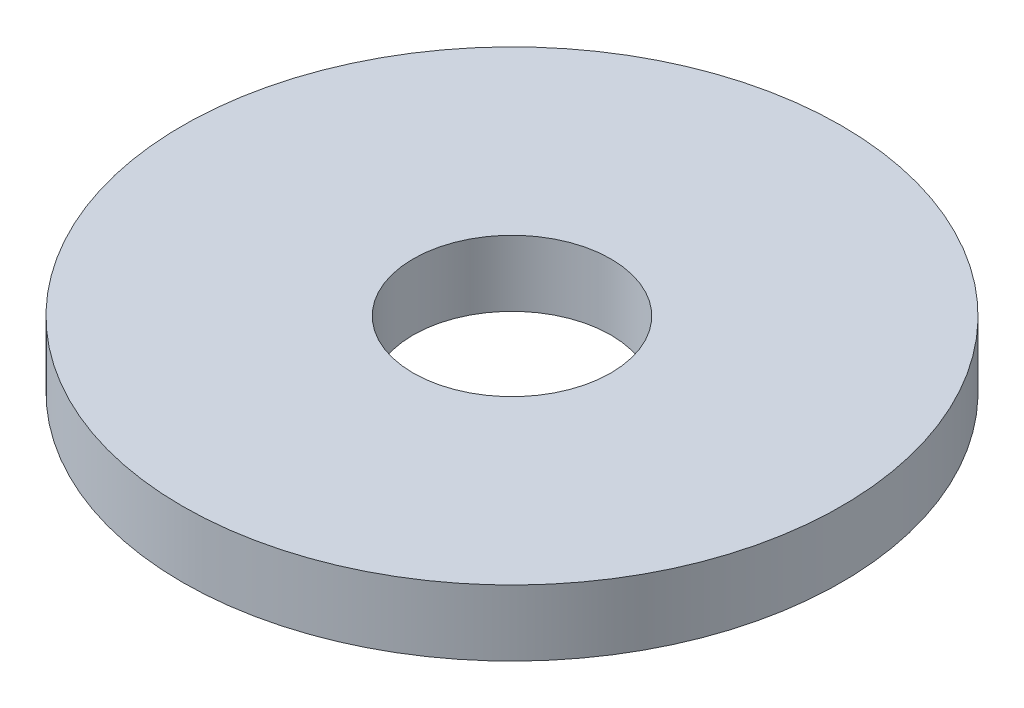
ISO-10303-21;
HEADER;
FILE_DESCRIPTION(('STEP AP214'),'2;1');
FILE_NAME('part.step','',(''),(''),'','','');
FILE_SCHEMA(('AUTOMOTIVE_DESIGN { 1 0 10303 214 1 1 1 1 }'));
ENDSEC;
DATA;
#1=APPLICATION_CONTEXT('core data for automotive mechanical design processes');
#2=APPLICATION_PROTOCOL_DEFINITION('international standard','automotive_design',2000,#1);
#3=PRODUCT_CONTEXT('',#1,'mechanical');
#4=PRODUCT('Part','Part','',(#3));
#5=PRODUCT_RELATED_PRODUCT_CATEGORY('part','',(#4));
#6=PRODUCT_DEFINITION_FORMATION('','',#4);
#7=PRODUCT_DEFINITION_CONTEXT('part definition',#1,'design');
#8=PRODUCT_DEFINITION('design','',#6,#7);
#9=PRODUCT_DEFINITION_SHAPE('','',#8);
#10=(LENGTH_UNIT() NAMED_UNIT(*) SI_UNIT(.MILLI.,.METRE.));
#11=(NAMED_UNIT(*) PLANE_ANGLE_UNIT() SI_UNIT($,.RADIAN.));
#12=(NAMED_UNIT(*) SI_UNIT($,.STERADIAN.) SOLID_ANGLE_UNIT());
#13=UNCERTAINTY_MEASURE_WITH_UNIT(LENGTH_MEASURE(1.E-05),#10,'distance_accuracy_value','');
#14=(GEOMETRIC_REPRESENTATION_CONTEXT(3) GLOBAL_UNCERTAINTY_ASSIGNED_CONTEXT((#13)) GLOBAL_UNIT_ASSIGNED_CONTEXT((#10,
#11,#12)) REPRESENTATION_CONTEXT('',''));
#15=CARTESIAN_POINT('',(0.,0.,0.));
#16=DIRECTION('',(0.,0.,1.));
#17=DIRECTION('',(1.,0.,0.));
#18=AXIS2_PLACEMENT_3D('',#15,#16,#17);
#19=CARTESIAN_POINT('',(0.,1.,0.));
#20=DIRECTION('',(0.,1.,0.));
#21=DIRECTION('',(0.,0.,1.));
#22=AXIS2_PLACEMENT_3D('',#19,#20,#21);
#23=PLANE('',#22);
#24=CARTESIAN_POINT('',(0.,1.,0.));
#25=DIRECTION('',(0.,1.,0.));
#26=DIRECTION('',(0.,0.,1.));
#27=AXIS2_PLACEMENT_3D('',#24,#25,#26);
#28=CIRCLE('',#27,5.);
#29=CARTESIAN_POINT('',(0.,1.,5.));
#30=VERTEX_POINT('',#29);
#31=EDGE_CURVE('E10',#30,#30,#28,.T.);
#32=ORIENTED_EDGE('',*,*,#31,.T.);
#33=EDGE_LOOP('',(#32));
#34=FACE_BOUND('',#33,.T.);
#35=CARTESIAN_POINT('',(0.,1.,0.));
#36=DIRECTION('',(0.,1.,0.));
#37=DIRECTION('',(0.,0.,1.));
#38=AXIS2_PLACEMENT_3D('',#35,#36,#37);
#39=CIRCLE('',#38,1.5);
#40=CARTESIAN_POINT('',(0.,1.,1.5));
#41=VERTEX_POINT('',#40);
#42=EDGE_CURVE('E50',#41,#41,#39,.T.);
#43=ORIENTED_EDGE('',*,*,#42,.F.);
#44=EDGE_LOOP('',(#43));
#45=FACE_BOUND('',#44,.T.);
#46=ADVANCED_FACE('F39',(#34,#45),#23,.T.);
#47=CARTESIAN_POINT('',(0.,0.,0.));
#48=DIRECTION('',(0.,1.,0.));
#49=DIRECTION('',(0.,0.,1.));
#50=AXIS2_PLACEMENT_3D('',#47,#48,#49);
#51=PLANE('',#50);
#52=CARTESIAN_POINT('',(0.,0.,0.));
#53=DIRECTION('',(0.,1.,0.));
#54=DIRECTION('',(0.,0.,1.));
#55=AXIS2_PLACEMENT_3D('',#52,#53,#54);
#56=CIRCLE('',#55,5.);
#57=CARTESIAN_POINT('',(0.,0.,5.));
#58=VERTEX_POINT('',#57);
#59=EDGE_CURVE('E43',#58,#58,#56,.T.);
#60=ORIENTED_EDGE('',*,*,#59,.F.);
#61=EDGE_LOOP('',(#60));
#62=FACE_BOUND('',#61,.T.);
#63=CARTESIAN_POINT('',(0.,0.,0.));
#64=DIRECTION('',(0.,1.,0.));
#65=DIRECTION('',(0.,0.,1.));
#66=AXIS2_PLACEMENT_3D('',#63,#64,#65);
#67=CIRCLE('',#66,1.5);
#68=CARTESIAN_POINT('',(0.,0.,1.5));
#69=VERTEX_POINT('',#68);
#70=EDGE_CURVE('E52',#69,#69,#67,.T.);
#71=ORIENTED_EDGE('',*,*,#70,.T.);
#72=EDGE_LOOP('',(#71));
#73=FACE_BOUND('',#72,.T.);
#74=ADVANCED_FACE('F62',(#62,#73),#51,.F.);
#75=CARTESIAN_POINT('',(0.,1.,0.));
#76=DIRECTION('',(0.,-1.,0.));
#77=DIRECTION('',(0.,0.,-1.));
#78=AXIS2_PLACEMENT_3D('',#75,#76,#77);
#79=CYLINDRICAL_SURFACE('',#78,5.);
#80=ORIENTED_EDGE('',*,*,#31,.F.);
#81=EDGE_LOOP('',(#80));
#82=FACE_BOUND('',#81,.T.);
#83=ORIENTED_EDGE('',*,*,#59,.T.);
#84=EDGE_LOOP('',(#83));
#85=FACE_BOUND('',#84,.T.);
#86=ADVANCED_FACE('F41',(#82,#85),#79,.T.);
#87=CARTESIAN_POINT('',(0.,1.,0.));
#88=DIRECTION('',(0.,-1.,0.));
#89=DIRECTION('',(0.,0.,-1.));
#90=AXIS2_PLACEMENT_3D('',#87,#88,#89);
#91=CYLINDRICAL_SURFACE('',#90,1.5);
#92=ORIENTED_EDGE('',*,*,#42,.T.);
#93=EDGE_LOOP('',(#92));
#94=FACE_BOUND('',#93,.T.);
#95=ORIENTED_EDGE('',*,*,#70,.F.);
#96=EDGE_LOOP('',(#95));
#97=FACE_BOUND('',#96,.T.);
#98=ADVANCED_FACE('F58',(#94,#97),#91,.F.);
#99=CLOSED_SHELL('',(#46,#74,#86,#98));
#100=MANIFOLD_SOLID_BREP('B2',#99);
#101=ADVANCED_BREP_SHAPE_REPRESENTATION('',(#18,#100),#14);
#102=SHAPE_DEFINITION_REPRESENTATION(#9,#101);
ENDSEC;
END-ISO-10303-21;
